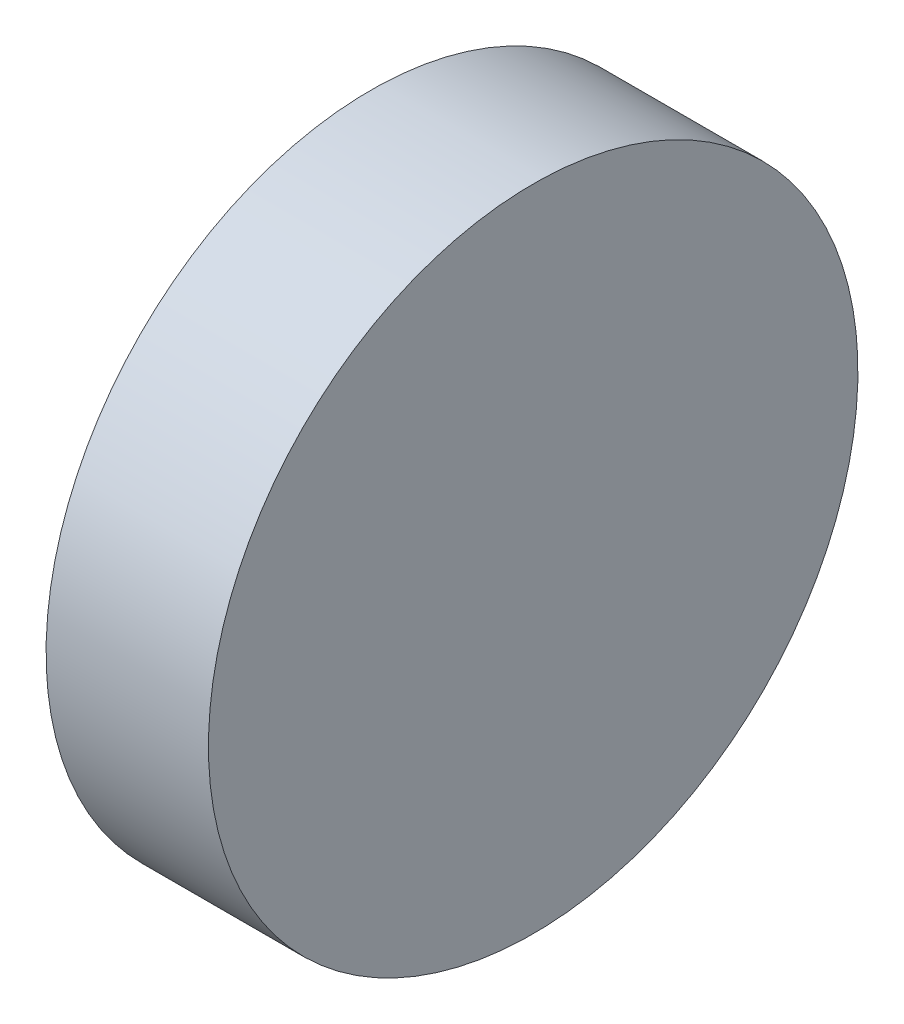
ISO-10303-21;
HEADER;
FILE_DESCRIPTION(('STEP AP214'),'2;1');
FILE_NAME('part.step','',(''),(''),'','','');
FILE_SCHEMA(('AUTOMOTIVE_DESIGN { 1 0 10303 214 1 1 1 1 }'));
ENDSEC;
DATA;
#1=APPLICATION_CONTEXT('core data for automotive mechanical design processes');
#2=APPLICATION_PROTOCOL_DEFINITION('international standard','automotive_design',2000,#1);
#3=PRODUCT_CONTEXT('',#1,'mechanical');
#4=PRODUCT('Part','Part','',(#3));
#5=PRODUCT_RELATED_PRODUCT_CATEGORY('part','',(#4));
#6=PRODUCT_DEFINITION_FORMATION('','',#4);
#7=PRODUCT_DEFINITION_CONTEXT('part definition',#1,'design');
#8=PRODUCT_DEFINITION('design','',#6,#7);
#9=PRODUCT_DEFINITION_SHAPE('','',#8);
#10=(LENGTH_UNIT() NAMED_UNIT(*) SI_UNIT(.MILLI.,.METRE.));
#11=(NAMED_UNIT(*) PLANE_ANGLE_UNIT() SI_UNIT($,.RADIAN.));
#12=(NAMED_UNIT(*) SI_UNIT($,.STERADIAN.) SOLID_ANGLE_UNIT());
#13=UNCERTAINTY_MEASURE_WITH_UNIT(LENGTH_MEASURE(1.E-05),#10,'distance_accuracy_value','');
#14=(GEOMETRIC_REPRESENTATION_CONTEXT(3) GLOBAL_UNCERTAINTY_ASSIGNED_CONTEXT((#13)) GLOBAL_UNIT_ASSIGNED_CONTEXT((#10,
#11,#12)) REPRESENTATION_CONTEXT('',''));
#15=CARTESIAN_POINT('',(0.,0.,0.));
#16=DIRECTION('',(0.,0.,1.));
#17=DIRECTION('',(1.,0.,0.));
#18=AXIS2_PLACEMENT_3D('',#15,#16,#17);
#19=CARTESIAN_POINT('',(-3.92244200236389,-2.03506966992483,-1.19863969746263));
#20=DIRECTION('',(1.,0.,0.));
#21=DIRECTION('',(0.,0.,-1.));
#22=AXIS2_PLACEMENT_3D('',#19,#20,#21);
#23=CYLINDRICAL_SURFACE('',#22,2.5);
#24=CARTESIAN_POINT('',(-2.4224420023639,-2.03506966992483,-1.19863969746263));
#25=DIRECTION('',(-1.,0.,0.));
#26=DIRECTION('',(0.,0.,1.));
#27=AXIS2_PLACEMENT_3D('',#24,#25,#26);
#28=CIRCLE('',#27,2.5);
#29=CARTESIAN_POINT('',(-2.4224420023639,-2.03506966992483,1.30136030253737));
#30=VERTEX_POINT('',#29);
#31=EDGE_CURVE('E18',#30,#30,#28,.T.);
#32=ORIENTED_EDGE('',*,*,#31,.T.);
#33=EDGE_LOOP('',(#32));
#34=FACE_BOUND('',#33,.T.);
#35=CARTESIAN_POINT('',(-3.72244200236389,-2.03506966992483,-1.19863969746263));
#36=DIRECTION('',(-1.,0.,0.));
#37=DIRECTION('',(0.,0.,1.));
#38=AXIS2_PLACEMENT_3D('',#35,#36,#37);
#39=CIRCLE('',#38,2.5);
#40=CARTESIAN_POINT('',(-3.72244200236389,-2.03506966992483,1.30136030253737));
#41=VERTEX_POINT('',#40);
#42=EDGE_CURVE('E9',#41,#41,#39,.T.);
#43=ORIENTED_EDGE('',*,*,#42,.F.);
#44=EDGE_LOOP('',(#43));
#45=FACE_BOUND('',#44,.T.);
#46=ADVANCED_FACE('F15',(#34,#45),#23,.T.);
#47=CARTESIAN_POINT('',(-3.92244200236389,-2.03506966992483,-1.19863969746263));
#48=DIRECTION('',(-1.,0.,0.));
#49=DIRECTION('',(0.,0.,1.));
#50=AXIS2_PLACEMENT_3D('',#47,#48,#49);
#51=PLANE('',#50);
#52=CARTESIAN_POINT('',(-3.92244200236389,-2.03506966992483,-1.19863969746263));
#53=DIRECTION('',(-1.,0.,0.));
#54=DIRECTION('',(0.,0.,1.));
#55=AXIS2_PLACEMENT_3D('',#52,#53,#54);
#56=CIRCLE('',#55,2.3);
#57=CARTESIAN_POINT('',(-3.92244200236389,-2.03506966992483,1.10136030253737));
#58=VERTEX_POINT('',#57);
#59=EDGE_CURVE('E33',#58,#58,#56,.T.);
#60=ORIENTED_EDGE('',*,*,#59,.T.);
#61=EDGE_LOOP('',(#60));
#62=FACE_BOUND('',#61,.T.);
#63=CARTESIAN_POINT('',(-3.92244200236389,-2.03506966992483,-1.19863969746263));
#64=DIRECTION('',(1.,0.,0.));
#65=DIRECTION('',(0.,0.,-1.));
#66=AXIS2_PLACEMENT_3D('',#63,#64,#65);
#67=CIRCLE('',#66,2.5);
#68=CARTESIAN_POINT('',(-3.92244200236389,-2.03506966992483,-3.69863969746263));
#69=VERTEX_POINT('',#68);
#70=EDGE_CURVE('E36',#69,#69,#67,.T.);
#71=ORIENTED_EDGE('',*,*,#70,.T.);
#72=EDGE_LOOP('',(#71));
#73=FACE_BOUND('',#72,.T.);
#74=ADVANCED_FACE('F77',(#62,#73),#51,.F.);
#75=CARTESIAN_POINT('',(-3.72244200236389,-2.03506966992483,-1.19863969746263));
#76=DIRECTION('',(-1.,0.,0.));
#77=DIRECTION('',(0.,0.,1.));
#78=AXIS2_PLACEMENT_3D('',#75,#76,#77);
#79=PLANE('',#78);
#80=CARTESIAN_POINT('',(-3.72244200236389,-2.03506966992483,-1.19863969746263));
#81=DIRECTION('',(-1.,0.,0.));
#82=DIRECTION('',(0.,0.,1.));
#83=AXIS2_PLACEMENT_3D('',#80,#81,#82);
#84=CIRCLE('',#83,2.3);
#85=CARTESIAN_POINT('',(-3.72244200236389,-2.03506966992483,1.10136030253737));
#86=VERTEX_POINT('',#85);
#87=EDGE_CURVE('E23',#86,#86,#84,.T.);
#88=ORIENTED_EDGE('',*,*,#87,.F.);
#89=EDGE_LOOP('',(#88));
#90=FACE_BOUND('',#89,.T.);
#91=ORIENTED_EDGE('',*,*,#42,.T.);
#92=EDGE_LOOP('',(#91));
#93=FACE_BOUND('',#92,.T.);
#94=ADVANCED_FACE('F81',(#90,#93),#79,.T.);
#95=CARTESIAN_POINT('',(-3.72244200236389,-2.03506966992483,-1.19863969746263));
#96=DIRECTION('',(-1.,0.,0.));
#97=DIRECTION('',(0.,0.,1.));
#98=AXIS2_PLACEMENT_3D('',#95,#96,#97);
#99=CYLINDRICAL_SURFACE('',#98,2.3);
#100=ORIENTED_EDGE('',*,*,#87,.T.);
#101=EDGE_LOOP('',(#100));
#102=FACE_BOUND('',#101,.T.);
#103=ORIENTED_EDGE('',*,*,#59,.F.);
#104=EDGE_LOOP('',(#103));
#105=FACE_BOUND('',#104,.T.);
#106=ADVANCED_FACE('F192',(#102,#105),#99,.T.);
#107=CARTESIAN_POINT('',(-5.42244200236389,-2.03506966992483,-1.19863969746263));
#108=DIRECTION('',(1.,0.,0.));
#109=DIRECTION('',(0.,0.,-1.));
#110=AXIS2_PLACEMENT_3D('',#107,#108,#109);
#111=CYLINDRICAL_SURFACE('',#110,2.5);
#112=CARTESIAN_POINT('',(-5.42244200236389,-2.03506966992483,-1.19863969746263));
#113=DIRECTION('',(1.,0.,0.));
#114=DIRECTION('',(0.,0.,-1.));
#115=AXIS2_PLACEMENT_3D('',#112,#113,#114);
#116=CIRCLE('',#115,2.5);
#117=CARTESIAN_POINT('',(-5.42244200236389,-2.03506966992483,-3.69863969746263));
#118=VERTEX_POINT('',#117);
#119=EDGE_CURVE('E38',#118,#118,#116,.T.);
#120=ORIENTED_EDGE('',*,*,#119,.T.);
#121=EDGE_LOOP('',(#120));
#122=FACE_BOUND('',#121,.T.);
#123=ORIENTED_EDGE('',*,*,#70,.F.);
#124=EDGE_LOOP('',(#123));
#125=FACE_BOUND('',#124,.T.);
#126=ADVANCED_FACE('F203',(#122,#125),#111,.T.);
#127=CARTESIAN_POINT('',(-5.42244200236389,-2.03506966992483,-1.19863969746263));
#128=DIRECTION('',(-1.,0.,0.));
#129=DIRECTION('',(0.,0.,1.));
#130=AXIS2_PLACEMENT_3D('',#127,#128,#129);
#131=PLANE('',#130);
#132=ORIENTED_EDGE('',*,*,#119,.F.);
#133=EDGE_LOOP('',(#132));
#134=FACE_BOUND('',#133,.T.);
#135=ADVANCED_FACE('F114',(#134),#131,.T.);
#136=CARTESIAN_POINT('',(-2.4224420023639,-2.03506966992483,-1.19863969746263));
#137=DIRECTION('',(-1.,0.,0.));
#138=DIRECTION('',(0.,-0.0387398114140827,0.999249331754393));
#139=AXIS2_PLACEMENT_3D('',#136,#137,#138);
#140=PLANE('',#139);
#141=ORIENTED_EDGE('',*,*,#31,.F.);
#142=EDGE_LOOP('',(#141));
#143=FACE_BOUND('',#142,.T.);
#144=CARTESIAN_POINT('',(-2.4224420023639,-2.03506966992483,-1.19863969746263));
#145=DIRECTION('',(-1.,0.,0.));
#146=DIRECTION('',(0.,0.,1.));
#147=AXIS2_PLACEMENT_3D('',#144,#145,#146);
#148=CIRCLE('',#147,4.);
#149=CARTESIAN_POINT('',(-2.4224420023639,-2.03506966992483,2.80136030253737));
#150=VERTEX_POINT('',#149);
#151=EDGE_CURVE('E44',#150,#150,#148,.F.);
#152=ORIENTED_EDGE('',*,*,#151,.F.);
#153=EDGE_LOOP('',(#152));
#154=FACE_BOUND('',#153,.T.);
#155=ADVANCED_FACE('F72',(#143,#154),#140,.T.);
#156=ORIENTED_EDGE('',*,*,#151,.T.);
#157=EDGE_LOOP('',(#156));
#158=FACE_BOUND('',#157,.T.);
#159=CARTESIAN_POINT('',(-2.4224420023639,-2.03506966992483,-1.19863969746263));
#160=DIRECTION('',(-1.,0.,0.));
#161=DIRECTION('',(0.,-0.0387398114140827,0.999249331754393));
#162=AXIS2_PLACEMENT_3D('',#159,#160,#161);
#163=CIRCLE('',#162,8.);
#164=CARTESIAN_POINT('',(-2.4224420023639,-2.34498816123749,6.79535495657251));
#165=VERTEX_POINT('',#164);
#166=EDGE_CURVE('E47',#165,#165,#163,.T.);
#167=ORIENTED_EDGE('',*,*,#166,.T.);
#168=EDGE_LOOP('',(#167));
#169=FACE_BOUND('',#168,.T.);
#170=ADVANCED_FACE('F56',(#158,#169),#140,.T.);
#171=CARTESIAN_POINT('',(1.57755799763611,-2.03506966992483,-1.19863969746263));
#172=DIRECTION('',(-1.,0.,0.));
#173=DIRECTION('',(0.,-0.0387398114140827,0.999249331754393));
#174=AXIS2_PLACEMENT_3D('',#171,#172,#173);
#175=PLANE('',#174);
#176=CARTESIAN_POINT('',(1.57755799763611,-2.03506966992483,-1.19863969746263));
#177=DIRECTION('',(-1.,0.,0.));
#178=DIRECTION('',(0.,-0.0387398114140827,0.999249331754393));
#179=AXIS2_PLACEMENT_3D('',#176,#177,#178);
#180=CIRCLE('',#179,8.);
#181=CARTESIAN_POINT('',(1.57755799763611,-2.34498816123749,6.79535495657251));
#182=VERTEX_POINT('',#181);
#183=EDGE_CURVE('E49',#182,#182,#180,.T.);
#184=ORIENTED_EDGE('',*,*,#183,.F.);
#185=EDGE_LOOP('',(#184));
#186=FACE_BOUND('',#185,.T.);
#187=ADVANCED_FACE('F63',(#186),#175,.F.);
#188=CARTESIAN_POINT('',(-2.4224420023639,-2.03506966992483,-1.19863969746263));
#189=DIRECTION('',(1.,0.,0.));
#190=DIRECTION('',(0.,0.0387398114140827,-0.999249331754393));
#191=AXIS2_PLACEMENT_3D('',#188,#189,#190);
#192=CYLINDRICAL_SURFACE('',#191,8.);
#193=ORIENTED_EDGE('',*,*,#166,.F.);
#194=EDGE_LOOP('',(#193));
#195=FACE_BOUND('',#194,.T.);
#196=ORIENTED_EDGE('',*,*,#183,.T.);
#197=EDGE_LOOP('',(#196));
#198=FACE_BOUND('',#197,.T.);
#199=ADVANCED_FACE('F61',(#195,#198),#192,.T.);
#200=CLOSED_SHELL('',(#46,#74,#94,#106,#126,#135,#155,#170,#187,#199));
#201=MANIFOLD_SOLID_BREP('B1',#200);
#202=ADVANCED_BREP_SHAPE_REPRESENTATION('',(#18,#201),#14);
#203=SHAPE_DEFINITION_REPRESENTATION(#9,#202);
ENDSEC;
END-ISO-10303-21;
